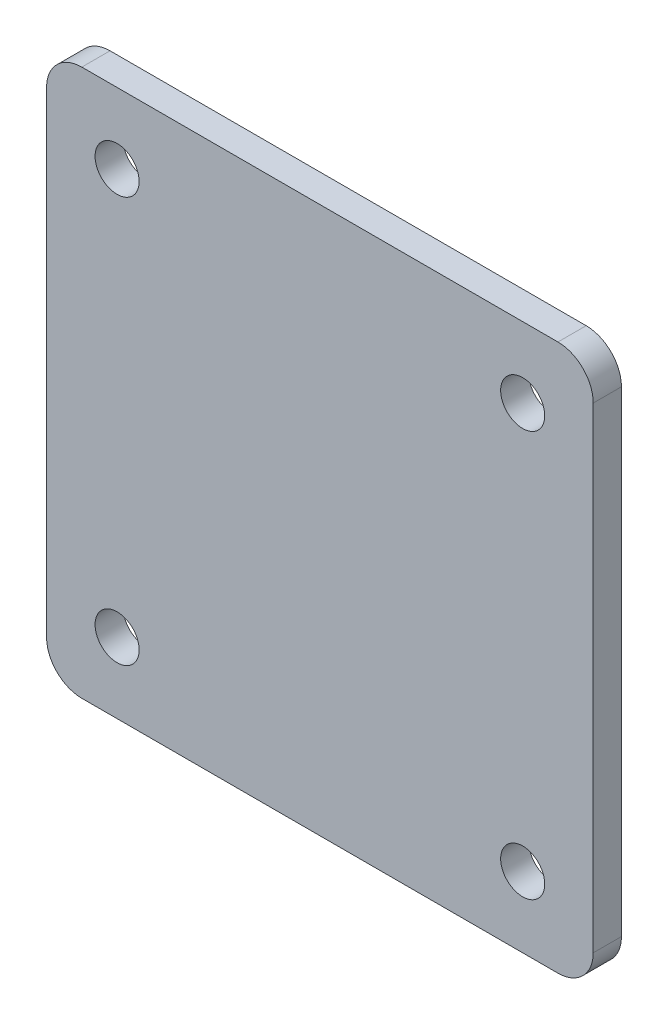
ISO-10303-21;
HEADER;
FILE_DESCRIPTION(('STEP AP214'),'2;1');
FILE_NAME('part.step','',(''),(''),'','','');
FILE_SCHEMA(('AUTOMOTIVE_DESIGN { 1 0 10303 214 1 1 1 1 }'));
ENDSEC;
DATA;
#1=APPLICATION_CONTEXT('core data for automotive mechanical design processes');
#2=APPLICATION_PROTOCOL_DEFINITION('international standard','automotive_design',2000,#1);
#3=PRODUCT_CONTEXT('',#1,'mechanical');
#4=PRODUCT('Part','Part','',(#3));
#5=PRODUCT_RELATED_PRODUCT_CATEGORY('part','',(#4));
#6=PRODUCT_DEFINITION_FORMATION('','',#4);
#7=PRODUCT_DEFINITION_CONTEXT('part definition',#1,'design');
#8=PRODUCT_DEFINITION('design','',#6,#7);
#9=PRODUCT_DEFINITION_SHAPE('','',#8);
#10=(LENGTH_UNIT() NAMED_UNIT(*) SI_UNIT(.MILLI.,.METRE.));
#11=(NAMED_UNIT(*) PLANE_ANGLE_UNIT() SI_UNIT($,.RADIAN.));
#12=(NAMED_UNIT(*) SI_UNIT($,.STERADIAN.) SOLID_ANGLE_UNIT());
#13=UNCERTAINTY_MEASURE_WITH_UNIT(LENGTH_MEASURE(1.E-05),#10,'distance_accuracy_value','');
#14=(GEOMETRIC_REPRESENTATION_CONTEXT(3) GLOBAL_UNCERTAINTY_ASSIGNED_CONTEXT((#13)) GLOBAL_UNIT_ASSIGNED_CONTEXT((#10,
#11,#12)) REPRESENTATION_CONTEXT('',''));
#15=CARTESIAN_POINT('',(0.,0.,0.));
#16=DIRECTION('',(0.,0.,1.));
#17=DIRECTION('',(1.,0.,0.));
#18=AXIS2_PLACEMENT_3D('',#15,#16,#17);
#19=CARTESIAN_POINT('',(-13.5,-13.5,1.6));
#20=DIRECTION('',(0.,0.,-1.));
#21=DIRECTION('',(-1.,0.,0.));
#22=AXIS2_PLACEMENT_3D('',#19,#20,#21);
#23=CYLINDRICAL_SURFACE('',#22,2.);
#24=CARTESIAN_POINT('',(-13.5,-13.5,0.));
#25=DIRECTION('',(0.,0.,1.));
#26=DIRECTION('',(-1.,0.,0.));
#27=AXIS2_PLACEMENT_3D('',#24,#25,#26);
#28=CIRCLE('',#27,2.);
#29=CARTESIAN_POINT('',(-15.5,-13.5,0.));
#30=VERTEX_POINT('',#29);
#31=CARTESIAN_POINT('',(-13.5,-15.5,0.));
#32=VERTEX_POINT('',#31);
#33=EDGE_CURVE('E129',#30,#32,#28,.T.);
#34=ORIENTED_EDGE('',*,*,#33,.T.);
#35=DIRECTION('',(0.,0.,-1.));
#36=VECTOR('',#35,1.);
#37=CARTESIAN_POINT('',(-13.5,-15.5,1.6));
#38=LINE('',#37,#36);
#39=CARTESIAN_POINT('',(-13.5,-15.5,1.6));
#40=VERTEX_POINT('',#39);
#41=EDGE_CURVE('E11',#40,#32,#38,.T.);
#42=ORIENTED_EDGE('',*,*,#41,.F.);
#43=CARTESIAN_POINT('',(-13.5,-13.5,1.6));
#44=DIRECTION('',(0.,0.,1.));
#45=DIRECTION('',(-1.,0.,0.));
#46=AXIS2_PLACEMENT_3D('',#43,#44,#45);
#47=CIRCLE('',#46,2.);
#48=CARTESIAN_POINT('',(-15.5,-13.5,1.6));
#49=VERTEX_POINT('',#48);
#50=EDGE_CURVE('E144',#49,#40,#47,.T.);
#51=ORIENTED_EDGE('',*,*,#50,.F.);
#52=DIRECTION('',(0.,0.,-1.));
#53=VECTOR('',#52,1.);
#54=CARTESIAN_POINT('',(-15.5,-13.5,1.6));
#55=LINE('',#54,#53);
#56=EDGE_CURVE('E125',#49,#30,#55,.T.);
#57=ORIENTED_EDGE('',*,*,#56,.T.);
#58=EDGE_LOOP('',(#34,#42,#51,#57));
#59=FACE_BOUND('',#58,.T.);
#60=ADVANCED_FACE('F33',(#59),#23,.T.);
#61=CARTESIAN_POINT('',(-13.5,-15.5,1.6));
#62=DIRECTION('',(0.,1.,0.));
#63=DIRECTION('',(0.,0.,1.));
#64=AXIS2_PLACEMENT_3D('',#61,#62,#63);
#65=PLANE('',#64);
#66=DIRECTION('',(1.,0.,0.));
#67=VECTOR('',#66,1.);
#68=CARTESIAN_POINT('',(-13.5,-15.5,0.));
#69=LINE('',#68,#67);
#70=CARTESIAN_POINT('',(13.5,-15.5,0.));
#71=VERTEX_POINT('',#70);
#72=EDGE_CURVE('E132',#32,#71,#69,.T.);
#73=ORIENTED_EDGE('',*,*,#72,.T.);
#74=DIRECTION('',(0.,0.,-1.));
#75=VECTOR('',#74,1.);
#76=CARTESIAN_POINT('',(13.5,-15.5,1.6));
#77=LINE('',#76,#75);
#78=CARTESIAN_POINT('',(13.5,-15.5,1.6));
#79=VERTEX_POINT('',#78);
#80=EDGE_CURVE('E41',#79,#71,#77,.T.);
#81=ORIENTED_EDGE('',*,*,#80,.F.);
#82=DIRECTION('',(1.,0.,0.));
#83=VECTOR('',#82,1.);
#84=CARTESIAN_POINT('',(-13.5,-15.5,1.6));
#85=LINE('',#84,#83);
#86=EDGE_CURVE('E92',#40,#79,#85,.T.);
#87=ORIENTED_EDGE('',*,*,#86,.F.);
#88=ORIENTED_EDGE('',*,*,#41,.T.);
#89=EDGE_LOOP('',(#73,#81,#87,#88));
#90=FACE_BOUND('',#89,.T.);
#91=ADVANCED_FACE('F230',(#90),#65,.F.);
#92=CARTESIAN_POINT('',(13.5,-13.5,1.6));
#93=DIRECTION('',(0.,0.,-1.));
#94=DIRECTION('',(-1.,0.,0.));
#95=AXIS2_PLACEMENT_3D('',#92,#93,#94);
#96=CYLINDRICAL_SURFACE('',#95,2.);
#97=CARTESIAN_POINT('',(13.5,-13.5,0.));
#98=DIRECTION('',(0.,0.,1.));
#99=DIRECTION('',(1.,0.,0.));
#100=AXIS2_PLACEMENT_3D('',#97,#98,#99);
#101=CIRCLE('',#100,2.);
#102=CARTESIAN_POINT('',(15.5,-13.5,0.));
#103=VERTEX_POINT('',#102);
#104=EDGE_CURVE('E135',#71,#103,#101,.T.);
#105=ORIENTED_EDGE('',*,*,#104,.T.);
#106=DIRECTION('',(0.,0.,-1.));
#107=VECTOR('',#106,1.);
#108=CARTESIAN_POINT('',(15.5,-13.5,1.6));
#109=LINE('',#108,#107);
#110=CARTESIAN_POINT('',(15.5,-13.5,1.6));
#111=VERTEX_POINT('',#110);
#112=EDGE_CURVE('E151',#111,#103,#109,.T.);
#113=ORIENTED_EDGE('',*,*,#112,.F.);
#114=CARTESIAN_POINT('',(13.5,-13.5,1.6));
#115=DIRECTION('',(0.,0.,1.));
#116=DIRECTION('',(1.,0.,0.));
#117=AXIS2_PLACEMENT_3D('',#114,#115,#116);
#118=CIRCLE('',#117,2.);
#119=EDGE_CURVE('E159',#79,#111,#118,.T.);
#120=ORIENTED_EDGE('',*,*,#119,.F.);
#121=ORIENTED_EDGE('',*,*,#80,.T.);
#122=EDGE_LOOP('',(#105,#113,#120,#121));
#123=FACE_BOUND('',#122,.T.);
#124=ADVANCED_FACE('F157',(#123),#96,.T.);
#125=CARTESIAN_POINT('',(15.5,-13.5,1.6));
#126=DIRECTION('',(-1.,0.,0.));
#127=DIRECTION('',(0.,0.,1.));
#128=AXIS2_PLACEMENT_3D('',#125,#126,#127);
#129=PLANE('',#128);
#130=DIRECTION('',(0.,1.,0.));
#131=VECTOR('',#130,1.);
#132=CARTESIAN_POINT('',(15.5,-13.5,0.));
#133=LINE('',#132,#131);
#134=CARTESIAN_POINT('',(15.5,13.5,0.));
#135=VERTEX_POINT('',#134);
#136=EDGE_CURVE('E137',#103,#135,#133,.T.);
#137=ORIENTED_EDGE('',*,*,#136,.T.);
#138=DIRECTION('',(0.,0.,-1.));
#139=VECTOR('',#138,1.);
#140=CARTESIAN_POINT('',(15.5,13.5,1.6));
#141=LINE('',#140,#139);
#142=CARTESIAN_POINT('',(15.5,13.5,1.6));
#143=VERTEX_POINT('',#142);
#144=EDGE_CURVE('E148',#143,#135,#141,.T.);
#145=ORIENTED_EDGE('',*,*,#144,.F.);
#146=DIRECTION('',(0.,1.,0.));
#147=VECTOR('',#146,1.);
#148=CARTESIAN_POINT('',(15.5,-13.5,1.6));
#149=LINE('',#148,#147);
#150=EDGE_CURVE('E171',#111,#143,#149,.T.);
#151=ORIENTED_EDGE('',*,*,#150,.F.);
#152=ORIENTED_EDGE('',*,*,#112,.T.);
#153=EDGE_LOOP('',(#137,#145,#151,#152));
#154=FACE_BOUND('',#153,.T.);
#155=ADVANCED_FACE('F167',(#154),#129,.F.);
#156=CARTESIAN_POINT('',(13.5,13.5,1.6));
#157=DIRECTION('',(0.,0.,-1.));
#158=DIRECTION('',(-1.,0.,0.));
#159=AXIS2_PLACEMENT_3D('',#156,#157,#158);
#160=CYLINDRICAL_SURFACE('',#159,2.);
#161=CARTESIAN_POINT('',(13.5,13.5,0.));
#162=DIRECTION('',(0.,0.,1.));
#163=DIRECTION('',(-1.,0.,0.));
#164=AXIS2_PLACEMENT_3D('',#161,#162,#163);
#165=CIRCLE('',#164,2.);
#166=CARTESIAN_POINT('',(13.5,15.5,0.));
#167=VERTEX_POINT('',#166);
#168=EDGE_CURVE('E139',#135,#167,#165,.T.);
#169=ORIENTED_EDGE('',*,*,#168,.T.);
#170=DIRECTION('',(0.,0.,-1.));
#171=VECTOR('',#170,1.);
#172=CARTESIAN_POINT('',(13.5,15.5,1.6));
#173=LINE('',#172,#171);
#174=CARTESIAN_POINT('',(13.5,15.5,1.6));
#175=VERTEX_POINT('',#174);
#176=EDGE_CURVE('E120',#175,#167,#173,.T.);
#177=ORIENTED_EDGE('',*,*,#176,.F.);
#178=CARTESIAN_POINT('',(13.5,13.5,1.6));
#179=DIRECTION('',(0.,0.,1.));
#180=DIRECTION('',(-1.,0.,0.));
#181=AXIS2_PLACEMENT_3D('',#178,#179,#180);
#182=CIRCLE('',#181,2.);
#183=EDGE_CURVE('E111',#143,#175,#182,.T.);
#184=ORIENTED_EDGE('',*,*,#183,.F.);
#185=ORIENTED_EDGE('',*,*,#144,.T.);
#186=EDGE_LOOP('',(#169,#177,#184,#185));
#187=FACE_BOUND('',#186,.T.);
#188=ADVANCED_FACE('F170',(#187),#160,.T.);
#189=CARTESIAN_POINT('',(-13.5,15.5,1.6));
#190=DIRECTION('',(0.,-1.,0.));
#191=DIRECTION('',(0.,0.,-1.));
#192=AXIS2_PLACEMENT_3D('',#189,#190,#191);
#193=PLANE('',#192);
#194=DIRECTION('',(-1.,0.,0.));
#195=VECTOR('',#194,1.);
#196=CARTESIAN_POINT('',(-13.5,15.5,0.));
#197=LINE('',#196,#195);
#198=CARTESIAN_POINT('',(-13.5,15.5,0.));
#199=VERTEX_POINT('',#198);
#200=EDGE_CURVE('E119',#167,#199,#197,.T.);
#201=ORIENTED_EDGE('',*,*,#200,.T.);
#202=DIRECTION('',(0.,0.,-1.));
#203=VECTOR('',#202,1.);
#204=CARTESIAN_POINT('',(-13.5,15.5,1.6));
#205=LINE('',#204,#203);
#206=CARTESIAN_POINT('',(-13.5,15.5,1.6));
#207=VERTEX_POINT('',#206);
#208=EDGE_CURVE('E116',#207,#199,#205,.T.);
#209=ORIENTED_EDGE('',*,*,#208,.F.);
#210=DIRECTION('',(-1.,0.,0.));
#211=VECTOR('',#210,1.);
#212=CARTESIAN_POINT('',(-13.5,15.5,1.6));
#213=LINE('',#212,#211);
#214=EDGE_CURVE('E105',#175,#207,#213,.T.);
#215=ORIENTED_EDGE('',*,*,#214,.F.);
#216=ORIENTED_EDGE('',*,*,#176,.T.);
#217=EDGE_LOOP('',(#201,#209,#215,#216));
#218=FACE_BOUND('',#217,.T.);
#219=ADVANCED_FACE('F117',(#218),#193,.F.);
#220=CARTESIAN_POINT('',(-13.5,13.5,1.6));
#221=DIRECTION('',(0.,0.,-1.));
#222=DIRECTION('',(-1.,0.,0.));
#223=AXIS2_PLACEMENT_3D('',#220,#221,#222);
#224=CYLINDRICAL_SURFACE('',#223,2.);
#225=CARTESIAN_POINT('',(-13.5,13.5,0.));
#226=DIRECTION('',(0.,0.,1.));
#227=DIRECTION('',(-1.,0.,0.));
#228=AXIS2_PLACEMENT_3D('',#225,#226,#227);
#229=CIRCLE('',#228,2.);
#230=CARTESIAN_POINT('',(-15.5,13.5,0.));
#231=VERTEX_POINT('',#230);
#232=EDGE_CURVE('E78',#199,#231,#229,.T.);
#233=ORIENTED_EDGE('',*,*,#232,.T.);
#234=DIRECTION('',(0.,0.,-1.));
#235=VECTOR('',#234,1.);
#236=CARTESIAN_POINT('',(-15.5,13.5,1.6));
#237=LINE('',#236,#235);
#238=CARTESIAN_POINT('',(-15.5,13.5,1.6));
#239=VERTEX_POINT('',#238);
#240=EDGE_CURVE('E121',#239,#231,#237,.T.);
#241=ORIENTED_EDGE('',*,*,#240,.F.);
#242=CARTESIAN_POINT('',(-13.5,13.5,1.6));
#243=DIRECTION('',(0.,0.,1.));
#244=DIRECTION('',(-1.,0.,0.));
#245=AXIS2_PLACEMENT_3D('',#242,#243,#244);
#246=CIRCLE('',#245,2.);
#247=EDGE_CURVE('E109',#207,#239,#246,.T.);
#248=ORIENTED_EDGE('',*,*,#247,.F.);
#249=ORIENTED_EDGE('',*,*,#208,.T.);
#250=EDGE_LOOP('',(#233,#241,#248,#249));
#251=FACE_BOUND('',#250,.T.);
#252=ADVANCED_FACE('F123',(#251),#224,.T.);
#253=CARTESIAN_POINT('',(-15.5,-13.5,1.6));
#254=DIRECTION('',(1.,0.,0.));
#255=DIRECTION('',(0.,0.,-1.));
#256=AXIS2_PLACEMENT_3D('',#253,#254,#255);
#257=PLANE('',#256);
#258=DIRECTION('',(0.,-1.,0.));
#259=VECTOR('',#258,1.);
#260=CARTESIAN_POINT('',(-15.5,-13.5,0.));
#261=LINE('',#260,#259);
#262=EDGE_CURVE('E84',#231,#30,#261,.T.);
#263=ORIENTED_EDGE('',*,*,#262,.T.);
#264=ORIENTED_EDGE('',*,*,#56,.F.);
#265=DIRECTION('',(0.,-1.,0.));
#266=VECTOR('',#265,1.);
#267=CARTESIAN_POINT('',(-15.5,-13.5,1.6));
#268=LINE('',#267,#266);
#269=EDGE_CURVE('E49',#239,#49,#268,.T.);
#270=ORIENTED_EDGE('',*,*,#269,.F.);
#271=ORIENTED_EDGE('',*,*,#240,.T.);
#272=EDGE_LOOP('',(#263,#264,#270,#271));
#273=FACE_BOUND('',#272,.T.);
#274=ADVANCED_FACE('F205',(#273),#257,.F.);
#275=CARTESIAN_POINT('',(-13.5,-13.5,1.6));
#276=DIRECTION('',(0.,0.,-1.));
#277=DIRECTION('',(-1.,0.,0.));
#278=AXIS2_PLACEMENT_3D('',#275,#276,#277);
#279=PLANE('',#278);
#280=CARTESIAN_POINT('',(-11.5,11.5,1.6));
#281=DIRECTION('',(0.,0.,1.));
#282=DIRECTION('',(1.,0.,0.));
#283=AXIS2_PLACEMENT_3D('',#280,#281,#282);
#284=CIRCLE('',#283,1.24999999999999);
#285=CARTESIAN_POINT('',(-10.25,11.5,1.6));
#286=VERTEX_POINT('',#285);
#287=EDGE_CURVE('E197',#286,#286,#284,.T.);
#288=ORIENTED_EDGE('',*,*,#287,.F.);
#289=EDGE_LOOP('',(#288));
#290=FACE_BOUND('',#289,.T.);
#291=CARTESIAN_POINT('',(11.5,11.5,1.6));
#292=DIRECTION('',(0.,0.,1.));
#293=DIRECTION('',(1.,0.,0.));
#294=AXIS2_PLACEMENT_3D('',#291,#292,#293);
#295=CIRCLE('',#294,1.24999999999999);
#296=CARTESIAN_POINT('',(12.75,11.5,1.6));
#297=VERTEX_POINT('',#296);
#298=EDGE_CURVE('E191',#297,#297,#295,.T.);
#299=ORIENTED_EDGE('',*,*,#298,.F.);
#300=EDGE_LOOP('',(#299));
#301=FACE_BOUND('',#300,.T.);
#302=CARTESIAN_POINT('',(11.5,-11.5,1.6));
#303=DIRECTION('',(0.,0.,1.));
#304=DIRECTION('',(1.,0.,0.));
#305=AXIS2_PLACEMENT_3D('',#302,#303,#304);
#306=CIRCLE('',#305,1.24999999999999);
#307=CARTESIAN_POINT('',(12.75,-11.5,1.6));
#308=VERTEX_POINT('',#307);
#309=EDGE_CURVE('E185',#308,#308,#306,.T.);
#310=ORIENTED_EDGE('',*,*,#309,.F.);
#311=EDGE_LOOP('',(#310));
#312=FACE_BOUND('',#311,.T.);
#313=CARTESIAN_POINT('',(-11.5,-11.5,1.6));
#314=DIRECTION('',(0.,0.,1.));
#315=DIRECTION('',(1.,0.,0.));
#316=AXIS2_PLACEMENT_3D('',#313,#314,#315);
#317=CIRCLE('',#316,1.24999999999999);
#318=CARTESIAN_POINT('',(-10.25,-11.5,1.6));
#319=VERTEX_POINT('',#318);
#320=EDGE_CURVE('E179',#319,#319,#317,.T.);
#321=ORIENTED_EDGE('',*,*,#320,.F.);
#322=EDGE_LOOP('',(#321));
#323=FACE_BOUND('',#322,.T.);
#324=ORIENTED_EDGE('',*,*,#50,.T.);
#325=ORIENTED_EDGE('',*,*,#86,.T.);
#326=ORIENTED_EDGE('',*,*,#119,.T.);
#327=ORIENTED_EDGE('',*,*,#150,.T.);
#328=ORIENTED_EDGE('',*,*,#183,.T.);
#329=ORIENTED_EDGE('',*,*,#214,.T.);
#330=ORIENTED_EDGE('',*,*,#247,.T.);
#331=ORIENTED_EDGE('',*,*,#269,.T.);
#332=EDGE_LOOP('',(#324,#325,#326,#327,#328,#329,#330,#331));
#333=FACE_BOUND('',#332,.T.);
#334=ADVANCED_FACE('F107',(#290,#301,#312,#323,#333),#279,.F.);
#335=CARTESIAN_POINT('',(-13.5,-13.5,0.));
#336=DIRECTION('',(0.,0.,-1.));
#337=DIRECTION('',(-1.,0.,0.));
#338=AXIS2_PLACEMENT_3D('',#335,#336,#337);
#339=PLANE('',#338);
#340=CARTESIAN_POINT('',(-11.5,11.5,0.));
#341=DIRECTION('',(0.,0.,1.));
#342=DIRECTION('',(1.,0.,0.));
#343=AXIS2_PLACEMENT_3D('',#340,#341,#342);
#344=CIRCLE('',#343,1.25);
#345=CARTESIAN_POINT('',(-10.25,11.5,0.));
#346=VERTEX_POINT('',#345);
#347=EDGE_CURVE('E194',#346,#346,#344,.T.);
#348=ORIENTED_EDGE('',*,*,#347,.T.);
#349=EDGE_LOOP('',(#348));
#350=FACE_BOUND('',#349,.T.);
#351=CARTESIAN_POINT('',(11.5,11.5,0.));
#352=DIRECTION('',(0.,0.,1.));
#353=DIRECTION('',(1.,0.,0.));
#354=AXIS2_PLACEMENT_3D('',#351,#352,#353);
#355=CIRCLE('',#354,1.25);
#356=CARTESIAN_POINT('',(12.75,11.5,0.));
#357=VERTEX_POINT('',#356);
#358=EDGE_CURVE('E188',#357,#357,#355,.T.);
#359=ORIENTED_EDGE('',*,*,#358,.T.);
#360=EDGE_LOOP('',(#359));
#361=FACE_BOUND('',#360,.T.);
#362=CARTESIAN_POINT('',(11.5,-11.5,0.));
#363=DIRECTION('',(0.,0.,1.));
#364=DIRECTION('',(1.,0.,0.));
#365=AXIS2_PLACEMENT_3D('',#362,#363,#364);
#366=CIRCLE('',#365,1.25);
#367=CARTESIAN_POINT('',(12.75,-11.5,0.));
#368=VERTEX_POINT('',#367);
#369=EDGE_CURVE('E182',#368,#368,#366,.T.);
#370=ORIENTED_EDGE('',*,*,#369,.T.);
#371=EDGE_LOOP('',(#370));
#372=FACE_BOUND('',#371,.T.);
#373=CARTESIAN_POINT('',(-11.5,-11.5,0.));
#374=DIRECTION('',(0.,0.,1.));
#375=DIRECTION('',(1.,0.,0.));
#376=AXIS2_PLACEMENT_3D('',#373,#374,#375);
#377=CIRCLE('',#376,1.25);
#378=CARTESIAN_POINT('',(-10.25,-11.5,0.));
#379=VERTEX_POINT('',#378);
#380=EDGE_CURVE('E133',#379,#379,#377,.T.);
#381=ORIENTED_EDGE('',*,*,#380,.T.);
#382=EDGE_LOOP('',(#381));
#383=FACE_BOUND('',#382,.T.);
#384=ORIENTED_EDGE('',*,*,#33,.F.);
#385=ORIENTED_EDGE('',*,*,#262,.F.);
#386=ORIENTED_EDGE('',*,*,#232,.F.);
#387=ORIENTED_EDGE('',*,*,#200,.F.);
#388=ORIENTED_EDGE('',*,*,#168,.F.);
#389=ORIENTED_EDGE('',*,*,#136,.F.);
#390=ORIENTED_EDGE('',*,*,#104,.F.);
#391=ORIENTED_EDGE('',*,*,#72,.F.);
#392=EDGE_LOOP('',(#384,#385,#386,#387,#388,#389,#390,#391));
#393=FACE_BOUND('',#392,.T.);
#394=ADVANCED_FACE('F163',(#350,#361,#372,#383,#393),#339,.T.);
#395=CARTESIAN_POINT('',(-11.5,-11.5,1.6));
#396=DIRECTION('',(0.,0.,1.));
#397=DIRECTION('',(1.,0.,0.));
#398=AXIS2_PLACEMENT_3D('',#395,#396,#397);
#399=CYLINDRICAL_SURFACE('',#398,1.24999999999999);
#400=ORIENTED_EDGE('',*,*,#380,.F.);
#401=EDGE_LOOP('',(#400));
#402=FACE_BOUND('',#401,.T.);
#403=ORIENTED_EDGE('',*,*,#320,.T.);
#404=EDGE_LOOP('',(#403));
#405=FACE_BOUND('',#404,.T.);
#406=ADVANCED_FACE('F213',(#402,#405),#399,.F.);
#407=CARTESIAN_POINT('',(11.5,-11.5,1.6));
#408=DIRECTION('',(0.,0.,1.));
#409=DIRECTION('',(1.,0.,0.));
#410=AXIS2_PLACEMENT_3D('',#407,#408,#409);
#411=CYLINDRICAL_SURFACE('',#410,1.24999999999999);
#412=ORIENTED_EDGE('',*,*,#369,.F.);
#413=EDGE_LOOP('',(#412));
#414=FACE_BOUND('',#413,.T.);
#415=ORIENTED_EDGE('',*,*,#309,.T.);
#416=EDGE_LOOP('',(#415));
#417=FACE_BOUND('',#416,.T.);
#418=ADVANCED_FACE('F215',(#414,#417),#411,.F.);
#419=CARTESIAN_POINT('',(11.5,11.5,1.6));
#420=DIRECTION('',(0.,0.,1.));
#421=DIRECTION('',(1.,0.,0.));
#422=AXIS2_PLACEMENT_3D('',#419,#420,#421);
#423=CYLINDRICAL_SURFACE('',#422,1.24999999999999);
#424=ORIENTED_EDGE('',*,*,#358,.F.);
#425=EDGE_LOOP('',(#424));
#426=FACE_BOUND('',#425,.T.);
#427=ORIENTED_EDGE('',*,*,#298,.T.);
#428=EDGE_LOOP('',(#427));
#429=FACE_BOUND('',#428,.T.);
#430=ADVANCED_FACE('F222',(#426,#429),#423,.F.);
#431=CARTESIAN_POINT('',(-11.5,11.5,1.6));
#432=DIRECTION('',(0.,0.,1.));
#433=DIRECTION('',(1.,0.,0.));
#434=AXIS2_PLACEMENT_3D('',#431,#432,#433);
#435=CYLINDRICAL_SURFACE('',#434,1.24999999999999);
#436=ORIENTED_EDGE('',*,*,#347,.F.);
#437=EDGE_LOOP('',(#436));
#438=FACE_BOUND('',#437,.T.);
#439=ORIENTED_EDGE('',*,*,#287,.T.);
#440=EDGE_LOOP('',(#439));
#441=FACE_BOUND('',#440,.T.);
#442=ADVANCED_FACE('F201',(#438,#441),#435,.F.);
#443=CLOSED_SHELL('',(#60,#91,#124,#155,#188,#219,#252,#274,#334,#394,#406,#418,#430,#442));
#444=MANIFOLD_SOLID_BREP('B2',#443);
#445=ADVANCED_BREP_SHAPE_REPRESENTATION('',(#18,#444),#14);
#446=SHAPE_DEFINITION_REPRESENTATION(#9,#445);
ENDSEC;
END-ISO-10303-21;
